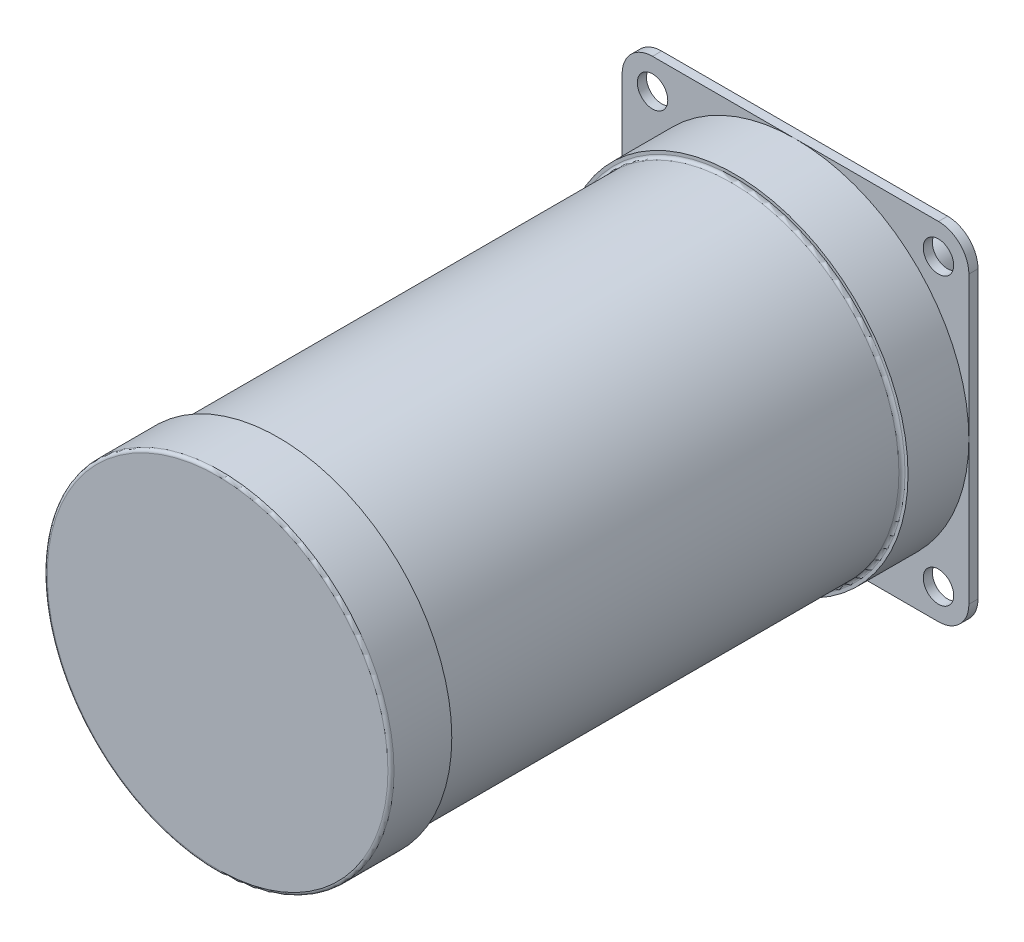
ISO-10303-21;
HEADER;
FILE_DESCRIPTION(('STEP AP214'),'2;1');
FILE_NAME('part.step','',(''),(''),'','','');
FILE_SCHEMA(('AUTOMOTIVE_DESIGN { 1 0 10303 214 1 1 1 1 }'));
ENDSEC;
DATA;
#1=APPLICATION_CONTEXT('core data for automotive mechanical design processes');
#2=APPLICATION_PROTOCOL_DEFINITION('international standard','automotive_design',2000,#1);
#3=PRODUCT_CONTEXT('',#1,'mechanical');
#4=PRODUCT('Part','Part','',(#3));
#5=PRODUCT_RELATED_PRODUCT_CATEGORY('part','',(#4));
#6=PRODUCT_DEFINITION_FORMATION('','',#4);
#7=PRODUCT_DEFINITION_CONTEXT('part definition',#1,'design');
#8=PRODUCT_DEFINITION('design','',#6,#7);
#9=PRODUCT_DEFINITION_SHAPE('','',#8);
#10=(LENGTH_UNIT() NAMED_UNIT(*) SI_UNIT(.MILLI.,.METRE.));
#11=(NAMED_UNIT(*) PLANE_ANGLE_UNIT() SI_UNIT($,.RADIAN.));
#12=(NAMED_UNIT(*) SI_UNIT($,.STERADIAN.) SOLID_ANGLE_UNIT());
#13=UNCERTAINTY_MEASURE_WITH_UNIT(LENGTH_MEASURE(1.E-05),#10,'distance_accuracy_value','');
#14=(GEOMETRIC_REPRESENTATION_CONTEXT(3) GLOBAL_UNCERTAINTY_ASSIGNED_CONTEXT((#13)) GLOBAL_UNIT_ASSIGNED_CONTEXT((#10,
#11,#12)) REPRESENTATION_CONTEXT('',''));
#15=CARTESIAN_POINT('',(0.,0.,0.));
#16=DIRECTION('',(0.,0.,1.));
#17=DIRECTION('',(1.,0.,0.));
#18=AXIS2_PLACEMENT_3D('',#15,#16,#17);
#19=CARTESIAN_POINT('',(0.,0.,1.5));
#20=DIRECTION('',(0.,0.,1.));
#21=DIRECTION('',(1.,0.,0.));
#22=AXIS2_PLACEMENT_3D('',#19,#20,#21);
#23=PLANE('',#22);
#24=CARTESIAN_POINT('',(52.,52.,1.5));
#25=DIRECTION('',(0.,0.,1.));
#26=DIRECTION('',(1.,0.,0.));
#27=AXIS2_PLACEMENT_3D('',#24,#25,#26);
#28=CIRCLE('',#27,2.5);
#29=CARTESIAN_POINT('',(54.5,52.,1.5));
#30=VERTEX_POINT('',#29);
#31=EDGE_CURVE('E290',#30,#30,#28,.F.);
#32=ORIENTED_EDGE('',*,*,#31,.T.);
#33=EDGE_LOOP('',(#32));
#34=FACE_BOUND('',#33,.T.);
#35=DIRECTION('',(0.,1.,0.));
#36=VECTOR('',#35,1.);
#37=CARTESIAN_POINT('',(57.,0.,1.5));
#38=LINE('',#37,#36);
#39=CARTESIAN_POINT('',(57.,28.5,1.5));
#40=VERTEX_POINT('',#39);
#41=CARTESIAN_POINT('',(57.,52.,1.5));
#42=VERTEX_POINT('',#41);
#43=EDGE_CURVE('E133',#40,#42,#38,.T.);
#44=ORIENTED_EDGE('',*,*,#43,.T.);
#45=CARTESIAN_POINT('',(52.,52.,1.5));
#46=DIRECTION('',(0.,0.,1.));
#47=DIRECTION('',(1.,0.,0.));
#48=AXIS2_PLACEMENT_3D('',#45,#46,#47);
#49=CIRCLE('',#48,5.);
#50=CARTESIAN_POINT('',(52.,57.,1.5));
#51=VERTEX_POINT('',#50);
#52=EDGE_CURVE('E54',#42,#51,#49,.T.);
#53=ORIENTED_EDGE('',*,*,#52,.T.);
#54=DIRECTION('',(-1.,0.,0.));
#55=VECTOR('',#54,1.);
#56=CARTESIAN_POINT('',(57.,57.,1.5));
#57=LINE('',#56,#55);
#58=CARTESIAN_POINT('',(28.5,57.,1.5));
#59=VERTEX_POINT('',#58);
#60=EDGE_CURVE('E144',#51,#59,#57,.T.);
#61=ORIENTED_EDGE('',*,*,#60,.T.);
#62=CARTESIAN_POINT('',(28.5,28.5,1.5));
#63=DIRECTION('',(0.,0.,1.));
#64=DIRECTION('',(1.,0.,0.));
#65=AXIS2_PLACEMENT_3D('',#62,#63,#64);
#66=CIRCLE('',#65,28.5);
#67=EDGE_CURVE('E143',#40,#59,#66,.T.);
#68=ORIENTED_EDGE('',*,*,#67,.F.);
#69=EDGE_LOOP('',(#44,#53,#61,#68));
#70=FACE_BOUND('',#69,.T.);
#71=ADVANCED_FACE('F38',(#34,#70),#23,.T.);
#72=CARTESIAN_POINT('',(4.99999999999999,52.,1.5));
#73=DIRECTION('',(0.,0.,1.));
#74=DIRECTION('',(1.,0.,0.));
#75=AXIS2_PLACEMENT_3D('',#72,#73,#74);
#76=CIRCLE('',#75,2.5);
#77=CARTESIAN_POINT('',(7.49999999999999,52.,1.5));
#78=VERTEX_POINT('',#77);
#79=EDGE_CURVE('E314',#78,#78,#76,.F.);
#80=ORIENTED_EDGE('',*,*,#79,.T.);
#81=EDGE_LOOP('',(#80));
#82=FACE_BOUND('',#81,.T.);
#83=CARTESIAN_POINT('',(5.,57.,1.5));
#84=VERTEX_POINT('',#83);
#85=EDGE_CURVE('E132',#59,#84,#57,.T.);
#86=ORIENTED_EDGE('',*,*,#85,.T.);
#87=CARTESIAN_POINT('',(5.,52.,1.5));
#88=DIRECTION('',(0.,0.,1.));
#89=DIRECTION('',(1.,0.,0.));
#90=AXIS2_PLACEMENT_3D('',#87,#88,#89);
#91=CIRCLE('',#90,5.);
#92=CARTESIAN_POINT('',(0.,52.,1.5));
#93=VERTEX_POINT('',#92);
#94=EDGE_CURVE('E228',#84,#93,#91,.T.);
#95=ORIENTED_EDGE('',*,*,#94,.T.);
#96=DIRECTION('',(0.,-1.,0.));
#97=VECTOR('',#96,1.);
#98=CARTESIAN_POINT('',(0.,57.,1.5));
#99=LINE('',#98,#97);
#100=CARTESIAN_POINT('',(0.,28.5,1.5));
#101=VERTEX_POINT('',#100);
#102=EDGE_CURVE('E164',#93,#101,#99,.T.);
#103=ORIENTED_EDGE('',*,*,#102,.T.);
#104=EDGE_CURVE('E152',#59,#101,#66,.T.);
#105=ORIENTED_EDGE('',*,*,#104,.F.);
#106=EDGE_LOOP('',(#86,#95,#103,#105));
#107=FACE_BOUND('',#106,.T.);
#108=ADVANCED_FACE('F348',(#82,#107),#23,.T.);
#109=CARTESIAN_POINT('',(4.99999999999999,5.,1.5));
#110=DIRECTION('',(0.,0.,1.));
#111=DIRECTION('',(1.,0.,0.));
#112=AXIS2_PLACEMENT_3D('',#109,#110,#111);
#113=CIRCLE('',#112,2.5);
#114=CARTESIAN_POINT('',(7.49999999999999,5.,1.5));
#115=VERTEX_POINT('',#114);
#116=EDGE_CURVE('E306',#115,#115,#113,.F.);
#117=ORIENTED_EDGE('',*,*,#116,.T.);
#118=EDGE_LOOP('',(#117));
#119=FACE_BOUND('',#118,.T.);
#120=CARTESIAN_POINT('',(0.,5.,1.5));
#121=VERTEX_POINT('',#120);
#122=EDGE_CURVE('E168',#101,#121,#99,.T.);
#123=ORIENTED_EDGE('',*,*,#122,.T.);
#124=CARTESIAN_POINT('',(5.,5.,1.5));
#125=DIRECTION('',(0.,0.,1.));
#126=DIRECTION('',(1.,0.,0.));
#127=AXIS2_PLACEMENT_3D('',#124,#125,#126);
#128=CIRCLE('',#127,5.);
#129=CARTESIAN_POINT('',(5.,0.,1.5));
#130=VERTEX_POINT('',#129);
#131=EDGE_CURVE('E219',#121,#130,#128,.T.);
#132=ORIENTED_EDGE('',*,*,#131,.T.);
#133=DIRECTION('',(1.,0.,0.));
#134=VECTOR('',#133,1.);
#135=CARTESIAN_POINT('',(0.,0.,1.5));
#136=LINE('',#135,#134);
#137=CARTESIAN_POINT('',(28.5,0.,1.5));
#138=VERTEX_POINT('',#137);
#139=EDGE_CURVE('E141',#130,#138,#136,.T.);
#140=ORIENTED_EDGE('',*,*,#139,.T.);
#141=EDGE_CURVE('E156',#101,#138,#66,.T.);
#142=ORIENTED_EDGE('',*,*,#141,.F.);
#143=EDGE_LOOP('',(#123,#132,#140,#142));
#144=FACE_BOUND('',#143,.T.);
#145=ADVANCED_FACE('F354',(#119,#144),#23,.T.);
#146=CARTESIAN_POINT('',(0.,57.,1.5));
#147=DIRECTION('',(1.,0.,0.));
#148=DIRECTION('',(0.,1.,0.));
#149=AXIS2_PLACEMENT_3D('',#146,#147,#148);
#150=PLANE('',#149);
#151=DIRECTION('',(0.,-1.,0.));
#152=VECTOR('',#151,1.);
#153=CARTESIAN_POINT('',(0.,57.,0.));
#154=LINE('',#153,#152);
#155=CARTESIAN_POINT('',(0.,52.,0.));
#156=VERTEX_POINT('',#155);
#157=CARTESIAN_POINT('',(0.,5.,0.));
#158=VERTEX_POINT('',#157);
#159=EDGE_CURVE('E171',#156,#158,#154,.T.);
#160=ORIENTED_EDGE('',*,*,#159,.T.);
#161=DIRECTION('',(0.,0.,-1.));
#162=VECTOR('',#161,1.);
#163=CARTESIAN_POINT('',(0.,5.,1.5));
#164=LINE('',#163,#162);
#165=EDGE_CURVE('E216',#158,#121,#164,.F.);
#166=ORIENTED_EDGE('',*,*,#165,.T.);
#167=ORIENTED_EDGE('',*,*,#122,.F.);
#168=ORIENTED_EDGE('',*,*,#102,.F.);
#169=DIRECTION('',(0.,0.,-1.));
#170=VECTOR('',#169,1.);
#171=CARTESIAN_POINT('',(0.,52.,1.5));
#172=LINE('',#171,#170);
#173=EDGE_CURVE('E212',#93,#156,#172,.T.);
#174=ORIENTED_EDGE('',*,*,#173,.T.);
#175=EDGE_LOOP('',(#160,#166,#167,#168,#174));
#176=FACE_BOUND('',#175,.T.);
#177=ADVANCED_FACE('F369',(#176),#150,.F.);
#178=CARTESIAN_POINT('',(0.,0.,1.5));
#179=DIRECTION('',(0.,1.,0.));
#180=DIRECTION('',(-1.,0.,0.));
#181=AXIS2_PLACEMENT_3D('',#178,#179,#180);
#182=PLANE('',#181);
#183=DIRECTION('',(1.,0.,0.));
#184=VECTOR('',#183,1.);
#185=CARTESIAN_POINT('',(0.,0.,0.));
#186=LINE('',#185,#184);
#187=CARTESIAN_POINT('',(5.,0.,0.));
#188=VERTEX_POINT('',#187);
#189=CARTESIAN_POINT('',(52.,0.,0.));
#190=VERTEX_POINT('',#189);
#191=EDGE_CURVE('E175',#188,#190,#186,.T.);
#192=ORIENTED_EDGE('',*,*,#191,.T.);
#193=DIRECTION('',(0.,0.,-1.));
#194=VECTOR('',#193,1.);
#195=CARTESIAN_POINT('',(52.,0.,1.5));
#196=LINE('',#195,#194);
#197=CARTESIAN_POINT('',(52.,0.,1.5));
#198=VERTEX_POINT('',#197);
#199=EDGE_CURVE('E207',#190,#198,#196,.F.);
#200=ORIENTED_EDGE('',*,*,#199,.T.);
#201=EDGE_CURVE('E167',#138,#198,#136,.T.);
#202=ORIENTED_EDGE('',*,*,#201,.F.);
#203=ORIENTED_EDGE('',*,*,#139,.F.);
#204=DIRECTION('',(0.,0.,-1.));
#205=VECTOR('',#204,1.);
#206=CARTESIAN_POINT('',(5.,0.,1.5));
#207=LINE('',#206,#205);
#208=EDGE_CURVE('E203',#130,#188,#207,.T.);
#209=ORIENTED_EDGE('',*,*,#208,.T.);
#210=EDGE_LOOP('',(#192,#200,#202,#203,#209));
#211=FACE_BOUND('',#210,.T.);
#212=ADVANCED_FACE('F374',(#211),#182,.F.);
#213=CARTESIAN_POINT('',(57.,0.,1.5));
#214=DIRECTION('',(-1.,0.,0.));
#215=DIRECTION('',(0.,0.,1.));
#216=AXIS2_PLACEMENT_3D('',#213,#214,#215);
#217=PLANE('',#216);
#218=CARTESIAN_POINT('',(57.,4.99999999999999,1.5));
#219=VERTEX_POINT('',#218);
#220=EDGE_CURVE('E119',#219,#40,#38,.T.);
#221=ORIENTED_EDGE('',*,*,#220,.F.);
#222=DIRECTION('',(0.,0.,-1.));
#223=VECTOR('',#222,1.);
#224=CARTESIAN_POINT('',(57.,4.99999999999999,1.5));
#225=LINE('',#224,#223);
#226=CARTESIAN_POINT('',(57.,4.99999999999999,0.));
#227=VERTEX_POINT('',#226);
#228=EDGE_CURVE('E187',#219,#227,#225,.T.);
#229=ORIENTED_EDGE('',*,*,#228,.T.);
#230=DIRECTION('',(0.,1.,0.));
#231=VECTOR('',#230,1.);
#232=CARTESIAN_POINT('',(57.,0.,0.));
#233=LINE('',#232,#231);
#234=CARTESIAN_POINT('',(57.,52.,0.));
#235=VERTEX_POINT('',#234);
#236=EDGE_CURVE('E179',#227,#235,#233,.T.);
#237=ORIENTED_EDGE('',*,*,#236,.T.);
#238=DIRECTION('',(0.,0.,-1.));
#239=VECTOR('',#238,1.);
#240=CARTESIAN_POINT('',(57.,52.,1.5));
#241=LINE('',#240,#239);
#242=EDGE_CURVE('E139',#235,#42,#241,.F.);
#243=ORIENTED_EDGE('',*,*,#242,.T.);
#244=ORIENTED_EDGE('',*,*,#43,.F.);
#245=EDGE_LOOP('',(#221,#229,#237,#243,#244));
#246=FACE_BOUND('',#245,.T.);
#247=ADVANCED_FACE('F136',(#246),#217,.F.);
#248=CARTESIAN_POINT('',(57.,57.,1.5));
#249=DIRECTION('',(0.,-1.,0.));
#250=DIRECTION('',(0.,0.,-1.));
#251=AXIS2_PLACEMENT_3D('',#248,#249,#250);
#252=PLANE('',#251);
#253=DIRECTION('',(-1.,0.,0.));
#254=VECTOR('',#253,1.);
#255=CARTESIAN_POINT('',(57.,57.,0.));
#256=LINE('',#255,#254);
#257=CARTESIAN_POINT('',(52.,57.,0.));
#258=VERTEX_POINT('',#257);
#259=CARTESIAN_POINT('',(5.,57.,0.));
#260=VERTEX_POINT('',#259);
#261=EDGE_CURVE('E182',#258,#260,#256,.T.);
#262=ORIENTED_EDGE('',*,*,#261,.T.);
#263=DIRECTION('',(0.,0.,-1.));
#264=VECTOR('',#263,1.);
#265=CARTESIAN_POINT('',(5.,57.,1.5));
#266=LINE('',#265,#264);
#267=EDGE_CURVE('E62',#260,#84,#266,.F.);
#268=ORIENTED_EDGE('',*,*,#267,.T.);
#269=ORIENTED_EDGE('',*,*,#85,.F.);
#270=ORIENTED_EDGE('',*,*,#60,.F.);
#271=DIRECTION('',(0.,0.,-1.));
#272=VECTOR('',#271,1.);
#273=CARTESIAN_POINT('',(52.,57.,1.5));
#274=LINE('',#273,#272);
#275=EDGE_CURVE('E222',#51,#258,#274,.T.);
#276=ORIENTED_EDGE('',*,*,#275,.T.);
#277=EDGE_LOOP('',(#262,#268,#269,#270,#276));
#278=FACE_BOUND('',#277,.T.);
#279=ADVANCED_FACE('F360',(#278),#252,.F.);
#280=CARTESIAN_POINT('',(52.,5.,1.5));
#281=DIRECTION('',(0.,0.,1.));
#282=DIRECTION('',(1.,0.,0.));
#283=AXIS2_PLACEMENT_3D('',#280,#281,#282);
#284=CIRCLE('',#283,2.5);
#285=CARTESIAN_POINT('',(54.5,5.,1.5));
#286=VERTEX_POINT('',#285);
#287=EDGE_CURVE('E297',#286,#286,#284,.F.);
#288=ORIENTED_EDGE('',*,*,#287,.T.);
#289=EDGE_LOOP('',(#288));
#290=FACE_BOUND('',#289,.T.);
#291=ORIENTED_EDGE('',*,*,#201,.T.);
#292=CARTESIAN_POINT('',(52.,4.99999999999999,1.5));
#293=DIRECTION('',(0.,0.,1.));
#294=DIRECTION('',(1.,0.,0.));
#295=AXIS2_PLACEMENT_3D('',#292,#293,#294);
#296=CIRCLE('',#295,5.);
#297=EDGE_CURVE('E127',#198,#219,#296,.T.);
#298=ORIENTED_EDGE('',*,*,#297,.T.);
#299=ORIENTED_EDGE('',*,*,#220,.T.);
#300=EDGE_CURVE('E124',#138,#40,#66,.T.);
#301=ORIENTED_EDGE('',*,*,#300,.F.);
#302=EDGE_LOOP('',(#291,#298,#299,#301));
#303=FACE_BOUND('',#302,.T.);
#304=ADVANCED_FACE('F122',(#290,#303),#23,.T.);
#305=CARTESIAN_POINT('',(0.,0.,0.));
#306=DIRECTION('',(0.,0.,1.));
#307=DIRECTION('',(1.,0.,0.));
#308=AXIS2_PLACEMENT_3D('',#305,#306,#307);
#309=PLANE('',#308);
#310=CARTESIAN_POINT('',(28.5,28.5,0.));
#311=DIRECTION('',(0.,0.,1.));
#312=DIRECTION('',(1.,0.,0.));
#313=AXIS2_PLACEMENT_3D('',#310,#311,#312);
#314=CIRCLE('',#313,19.5);
#315=CARTESIAN_POINT('',(48.,28.5,0.));
#316=VERTEX_POINT('',#315);
#317=EDGE_CURVE('E245',#316,#316,#314,.T.);
#318=ORIENTED_EDGE('',*,*,#317,.T.);
#319=EDGE_LOOP('',(#318));
#320=FACE_BOUND('',#319,.T.);
#321=CARTESIAN_POINT('',(52.,5.,0.));
#322=DIRECTION('',(0.,0.,-1.));
#323=DIRECTION('',(-1.,0.,0.));
#324=AXIS2_PLACEMENT_3D('',#321,#322,#323);
#325=CIRCLE('',#324,2.5);
#326=CARTESIAN_POINT('',(49.5,5.,0.));
#327=VERTEX_POINT('',#326);
#328=EDGE_CURVE('E301',#327,#327,#325,.T.);
#329=ORIENTED_EDGE('',*,*,#328,.F.);
#330=EDGE_LOOP('',(#329));
#331=FACE_BOUND('',#330,.T.);
#332=CARTESIAN_POINT('',(4.99999999999999,5.,0.));
#333=DIRECTION('',(0.,0.,-1.));
#334=DIRECTION('',(-1.,0.,0.));
#335=AXIS2_PLACEMENT_3D('',#332,#333,#334);
#336=CIRCLE('',#335,2.5);
#337=CARTESIAN_POINT('',(2.49999999999999,5.,0.));
#338=VERTEX_POINT('',#337);
#339=EDGE_CURVE('E310',#338,#338,#336,.T.);
#340=ORIENTED_EDGE('',*,*,#339,.F.);
#341=EDGE_LOOP('',(#340));
#342=FACE_BOUND('',#341,.T.);
#343=CARTESIAN_POINT('',(4.99999999999999,52.,0.));
#344=DIRECTION('',(0.,0.,-1.));
#345=DIRECTION('',(-1.,0.,0.));
#346=AXIS2_PLACEMENT_3D('',#343,#344,#345);
#347=CIRCLE('',#346,2.5);
#348=CARTESIAN_POINT('',(2.49999999999999,52.,0.));
#349=VERTEX_POINT('',#348);
#350=EDGE_CURVE('E295',#349,#349,#347,.T.);
#351=ORIENTED_EDGE('',*,*,#350,.F.);
#352=EDGE_LOOP('',(#351));
#353=FACE_BOUND('',#352,.T.);
#354=CARTESIAN_POINT('',(52.,52.,0.));
#355=DIRECTION('',(0.,0.,-1.));
#356=DIRECTION('',(-1.,0.,0.));
#357=AXIS2_PLACEMENT_3D('',#354,#355,#356);
#358=CIRCLE('',#357,2.5);
#359=CARTESIAN_POINT('',(49.5,52.,0.));
#360=VERTEX_POINT('',#359);
#361=EDGE_CURVE('E287',#360,#360,#358,.T.);
#362=ORIENTED_EDGE('',*,*,#361,.F.);
#363=EDGE_LOOP('',(#362));
#364=FACE_BOUND('',#363,.T.);
#365=ORIENTED_EDGE('',*,*,#236,.F.);
#366=CARTESIAN_POINT('',(52.,4.99999999999999,0.));
#367=DIRECTION('',(0.,0.,1.));
#368=DIRECTION('',(1.,0.,0.));
#369=AXIS2_PLACEMENT_3D('',#366,#367,#368);
#370=CIRCLE('',#369,5.);
#371=EDGE_CURVE('E200',#227,#190,#370,.F.);
#372=ORIENTED_EDGE('',*,*,#371,.T.);
#373=ORIENTED_EDGE('',*,*,#191,.F.);
#374=CARTESIAN_POINT('',(5.,5.,0.));
#375=DIRECTION('',(0.,0.,1.));
#376=DIRECTION('',(1.,0.,0.));
#377=AXIS2_PLACEMENT_3D('',#374,#375,#376);
#378=CIRCLE('',#377,5.);
#379=EDGE_CURVE('E197',#188,#158,#378,.F.);
#380=ORIENTED_EDGE('',*,*,#379,.T.);
#381=ORIENTED_EDGE('',*,*,#159,.F.);
#382=CARTESIAN_POINT('',(5.,52.,0.));
#383=DIRECTION('',(0.,0.,1.));
#384=DIRECTION('',(1.,0.,0.));
#385=AXIS2_PLACEMENT_3D('',#382,#383,#384);
#386=CIRCLE('',#385,5.);
#387=EDGE_CURVE('E194',#156,#260,#386,.F.);
#388=ORIENTED_EDGE('',*,*,#387,.T.);
#389=ORIENTED_EDGE('',*,*,#261,.F.);
#390=CARTESIAN_POINT('',(52.,52.,0.));
#391=DIRECTION('',(0.,0.,1.));
#392=DIRECTION('',(1.,0.,0.));
#393=AXIS2_PLACEMENT_3D('',#390,#391,#392);
#394=CIRCLE('',#393,5.);
#395=EDGE_CURVE('E191',#258,#235,#394,.F.);
#396=ORIENTED_EDGE('',*,*,#395,.T.);
#397=EDGE_LOOP('',(#365,#372,#373,#380,#381,#388,#389,#396));
#398=FACE_BOUND('',#397,.T.);
#399=ADVANCED_FACE('F359',(#320,#331,#342,#353,#364,#398),#309,.F.);
#400=CARTESIAN_POINT('',(28.5,28.5,11.5));
#401=DIRECTION('',(0.,0.,-1.));
#402=DIRECTION('',(-1.,0.,0.));
#403=AXIS2_PLACEMENT_3D('',#400,#401,#402);
#404=CYLINDRICAL_SURFACE('',#403,28.5);
#405=CARTESIAN_POINT('',(28.5,28.5,11.5));
#406=DIRECTION('',(0.,0.,1.));
#407=DIRECTION('',(1.,0.,0.));
#408=AXIS2_PLACEMENT_3D('',#405,#406,#407);
#409=CIRCLE('',#408,28.5);
#410=CARTESIAN_POINT('',(57.,28.5,11.5));
#411=VERTEX_POINT('',#410);
#412=EDGE_CURVE('E149',#411,#411,#409,.T.);
#413=ORIENTED_EDGE('',*,*,#412,.F.);
#414=EDGE_LOOP('',(#413));
#415=FACE_BOUND('',#414,.T.);
#416=ORIENTED_EDGE('',*,*,#67,.T.);
#417=ORIENTED_EDGE('',*,*,#104,.T.);
#418=ORIENTED_EDGE('',*,*,#141,.T.);
#419=ORIENTED_EDGE('',*,*,#300,.T.);
#420=EDGE_LOOP('',(#416,#417,#418,#419));
#421=FACE_BOUND('',#420,.T.);
#422=ADVANCED_FACE('F154',(#415,#421),#404,.T.);
#423=CARTESIAN_POINT('',(28.5,28.5,11.5));
#424=DIRECTION('',(0.,0.,1.));
#425=DIRECTION('',(1.,0.,0.));
#426=AXIS2_PLACEMENT_3D('',#423,#424,#425);
#427=PLANE('',#426);
#428=CARTESIAN_POINT('',(28.5,28.5,11.5));
#429=DIRECTION('',(0.,0.,1.));
#430=DIRECTION('',(1.,0.,0.));
#431=AXIS2_PLACEMENT_3D('',#428,#429,#430);
#432=CIRCLE('',#431,28.);
#433=CARTESIAN_POINT('',(56.5,28.5,11.5));
#434=VERTEX_POINT('',#433);
#435=EDGE_CURVE('E11',#434,#434,#432,.F.);
#436=ORIENTED_EDGE('',*,*,#435,.T.);
#437=EDGE_LOOP('',(#436));
#438=FACE_BOUND('',#437,.T.);
#439=ORIENTED_EDGE('',*,*,#412,.T.);
#440=EDGE_LOOP('',(#439));
#441=FACE_BOUND('',#440,.T.);
#442=ADVANCED_FACE('F412',(#438,#441),#427,.T.);
#443=CARTESIAN_POINT('',(28.5,28.5,86.5));
#444=DIRECTION('',(0.,0.,-1.));
#445=DIRECTION('',(-1.,0.,0.));
#446=AXIS2_PLACEMENT_3D('',#443,#444,#445);
#447=CYLINDRICAL_SURFACE('',#446,27.5);
#448=CARTESIAN_POINT('',(28.5,28.5,86.));
#449=DIRECTION('',(0.,0.,1.));
#450=DIRECTION('',(1.,0.,0.));
#451=AXIS2_PLACEMENT_3D('',#448,#449,#450);
#452=CIRCLE('',#451,27.5);
#453=CARTESIAN_POINT('',(56.,28.5,86.));
#454=VERTEX_POINT('',#453);
#455=EDGE_CURVE('E47',#454,#454,#452,.F.);
#456=ORIENTED_EDGE('',*,*,#455,.T.);
#457=EDGE_LOOP('',(#456));
#458=FACE_BOUND('',#457,.T.);
#459=CARTESIAN_POINT('',(28.5,28.5,12.));
#460=DIRECTION('',(0.,0.,1.));
#461=DIRECTION('',(1.,0.,0.));
#462=AXIS2_PLACEMENT_3D('',#459,#460,#461);
#463=CIRCLE('',#462,27.5);
#464=CARTESIAN_POINT('',(56.,28.5,12.));
#465=VERTEX_POINT('',#464);
#466=EDGE_CURVE('E261',#465,#465,#463,.T.);
#467=ORIENTED_EDGE('',*,*,#466,.T.);
#468=EDGE_LOOP('',(#467));
#469=FACE_BOUND('',#468,.T.);
#470=ADVANCED_FACE('F268',(#458,#469),#447,.T.);
#471=CARTESIAN_POINT('',(28.5,28.5,96.5));
#472=DIRECTION('',(0.,0.,-1.));
#473=DIRECTION('',(-1.,0.,0.));
#474=AXIS2_PLACEMENT_3D('',#471,#472,#473);
#475=CYLINDRICAL_SURFACE('',#474,28.5);
#476=CARTESIAN_POINT('',(28.5,28.5,96.));
#477=DIRECTION('',(0.,0.,1.));
#478=DIRECTION('',(1.,0.,0.));
#479=AXIS2_PLACEMENT_3D('',#476,#477,#478);
#480=CIRCLE('',#479,28.5);
#481=CARTESIAN_POINT('',(57.,28.5,96.));
#482=VERTEX_POINT('',#481);
#483=EDGE_CURVE('E253',#482,#482,#480,.F.);
#484=ORIENTED_EDGE('',*,*,#483,.T.);
#485=EDGE_LOOP('',(#484));
#486=FACE_BOUND('',#485,.T.);
#487=CARTESIAN_POINT('',(28.5,28.5,86.5));
#488=DIRECTION('',(0.,0.,1.));
#489=DIRECTION('',(1.,0.,0.));
#490=AXIS2_PLACEMENT_3D('',#487,#488,#489);
#491=CIRCLE('',#490,28.5);
#492=CARTESIAN_POINT('',(57.,28.5,86.5));
#493=VERTEX_POINT('',#492);
#494=EDGE_CURVE('E150',#493,#493,#491,.T.);
#495=ORIENTED_EDGE('',*,*,#494,.T.);
#496=EDGE_LOOP('',(#495));
#497=FACE_BOUND('',#496,.T.);
#498=ADVANCED_FACE('F423',(#486,#497),#475,.T.);
#499=CARTESIAN_POINT('',(28.5,28.5,96.5));
#500=DIRECTION('',(0.,0.,1.));
#501=DIRECTION('',(1.,0.,0.));
#502=AXIS2_PLACEMENT_3D('',#499,#500,#501);
#503=PLANE('',#502);
#504=CARTESIAN_POINT('',(28.5,28.5,96.5));
#505=DIRECTION('',(0.,0.,1.));
#506=DIRECTION('',(1.,0.,0.));
#507=AXIS2_PLACEMENT_3D('',#504,#505,#506);
#508=CIRCLE('',#507,28.);
#509=CARTESIAN_POINT('',(56.5,28.5,96.5));
#510=VERTEX_POINT('',#509);
#511=EDGE_CURVE('E249',#510,#510,#508,.T.);
#512=ORIENTED_EDGE('',*,*,#511,.T.);
#513=EDGE_LOOP('',(#512));
#514=FACE_BOUND('',#513,.T.);
#515=ADVANCED_FACE('F281',(#514),#503,.T.);
#516=CARTESIAN_POINT('',(28.5,28.5,86.5));
#517=DIRECTION('',(0.,0.,1.));
#518=DIRECTION('',(1.,0.,0.));
#519=AXIS2_PLACEMENT_3D('',#516,#517,#518);
#520=PLANE('',#519);
#521=CARTESIAN_POINT('',(28.5,28.5,86.5));
#522=DIRECTION('',(0.,0.,1.));
#523=DIRECTION('',(1.,0.,0.));
#524=AXIS2_PLACEMENT_3D('',#521,#522,#523);
#525=CIRCLE('',#524,28.);
#526=CARTESIAN_POINT('',(56.5,28.5,86.5));
#527=VERTEX_POINT('',#526);
#528=EDGE_CURVE('E257',#527,#527,#525,.T.);
#529=ORIENTED_EDGE('',*,*,#528,.T.);
#530=EDGE_LOOP('',(#529));
#531=FACE_BOUND('',#530,.T.);
#532=ORIENTED_EDGE('',*,*,#494,.F.);
#533=EDGE_LOOP('',(#532));
#534=FACE_BOUND('',#533,.T.);
#535=ADVANCED_FACE('F277',(#531,#534),#520,.F.);
#536=CARTESIAN_POINT('',(52.,52.,96.501));
#537=DIRECTION('',(0.,0.,-1.));
#538=DIRECTION('',(-1.,0.,0.));
#539=AXIS2_PLACEMENT_3D('',#536,#537,#538);
#540=CYLINDRICAL_SURFACE('',#539,2.5);
#541=ORIENTED_EDGE('',*,*,#31,.F.);
#542=EDGE_LOOP('',(#541));
#543=FACE_BOUND('',#542,.T.);
#544=ORIENTED_EDGE('',*,*,#361,.T.);
#545=EDGE_LOOP('',(#544));
#546=FACE_BOUND('',#545,.T.);
#547=ADVANCED_FACE('F280',(#543,#546),#540,.F.);
#548=CARTESIAN_POINT('',(4.99999999999999,52.,96.501));
#549=DIRECTION('',(0.,0.,-1.));
#550=DIRECTION('',(-1.,0.,0.));
#551=AXIS2_PLACEMENT_3D('',#548,#549,#550);
#552=CYLINDRICAL_SURFACE('',#551,2.5);
#553=ORIENTED_EDGE('',*,*,#79,.F.);
#554=EDGE_LOOP('',(#553));
#555=FACE_BOUND('',#554,.T.);
#556=ORIENTED_EDGE('',*,*,#350,.T.);
#557=EDGE_LOOP('',(#556));
#558=FACE_BOUND('',#557,.T.);
#559=ADVANCED_FACE('F432',(#555,#558),#552,.F.);
#560=CARTESIAN_POINT('',(4.99999999999999,5.,96.501));
#561=DIRECTION('',(0.,0.,-1.));
#562=DIRECTION('',(-1.,0.,0.));
#563=AXIS2_PLACEMENT_3D('',#560,#561,#562);
#564=CYLINDRICAL_SURFACE('',#563,2.5);
#565=ORIENTED_EDGE('',*,*,#116,.F.);
#566=EDGE_LOOP('',(#565));
#567=FACE_BOUND('',#566,.T.);
#568=ORIENTED_EDGE('',*,*,#339,.T.);
#569=EDGE_LOOP('',(#568));
#570=FACE_BOUND('',#569,.T.);
#571=ADVANCED_FACE('F436',(#567,#570),#564,.F.);
#572=CARTESIAN_POINT('',(52.,5.,96.501));
#573=DIRECTION('',(0.,0.,-1.));
#574=DIRECTION('',(-1.,0.,0.));
#575=AXIS2_PLACEMENT_3D('',#572,#573,#574);
#576=CYLINDRICAL_SURFACE('',#575,2.5);
#577=ORIENTED_EDGE('',*,*,#287,.F.);
#578=EDGE_LOOP('',(#577));
#579=FACE_BOUND('',#578,.T.);
#580=ORIENTED_EDGE('',*,*,#328,.T.);
#581=EDGE_LOOP('',(#580));
#582=FACE_BOUND('',#581,.T.);
#583=ADVANCED_FACE('F344',(#579,#582),#576,.F.);
#584=CARTESIAN_POINT('',(28.5,28.5,-1.5));
#585=DIRECTION('',(0.,0.,1.));
#586=DIRECTION('',(1.,0.,0.));
#587=AXIS2_PLACEMENT_3D('',#584,#585,#586);
#588=CYLINDRICAL_SURFACE('',#587,19.);
#589=CARTESIAN_POINT('',(28.5,28.5,-1.));
#590=DIRECTION('',(0.,0.,-1.));
#591=DIRECTION('',(-1.,0.,0.));
#592=AXIS2_PLACEMENT_3D('',#589,#590,#591);
#593=CIRCLE('',#592,19.);
#594=CARTESIAN_POINT('',(9.49999999999999,28.5,-1.));
#595=VERTEX_POINT('',#594);
#596=EDGE_CURVE('E241',#595,#595,#593,.F.);
#597=ORIENTED_EDGE('',*,*,#596,.T.);
#598=EDGE_LOOP('',(#597));
#599=FACE_BOUND('',#598,.T.);
#600=CARTESIAN_POINT('',(28.5,28.5,-0.5));
#601=DIRECTION('',(0.,0.,1.));
#602=DIRECTION('',(1.,0.,0.));
#603=AXIS2_PLACEMENT_3D('',#600,#601,#602);
#604=CIRCLE('',#603,19.);
#605=CARTESIAN_POINT('',(47.5,28.5,-0.5));
#606=VERTEX_POINT('',#605);
#607=EDGE_CURVE('E237',#606,#606,#604,.F.);
#608=ORIENTED_EDGE('',*,*,#607,.T.);
#609=EDGE_LOOP('',(#608));
#610=FACE_BOUND('',#609,.T.);
#611=ADVANCED_FACE('F338',(#599,#610),#588,.T.);
#612=CARTESIAN_POINT('',(28.5,28.5,-1.5));
#613=DIRECTION('',(0.,0.,-1.));
#614=DIRECTION('',(-1.,0.,0.));
#615=AXIS2_PLACEMENT_3D('',#612,#613,#614);
#616=PLANE('',#615);
#617=CARTESIAN_POINT('',(28.5,28.5,-1.5));
#618=DIRECTION('',(0.,0.,-1.));
#619=DIRECTION('',(-1.,0.,0.));
#620=AXIS2_PLACEMENT_3D('',#617,#618,#619);
#621=CIRCLE('',#620,18.5);
#622=CARTESIAN_POINT('',(9.99999999999999,28.5,-1.5));
#623=VERTEX_POINT('',#622);
#624=EDGE_CURVE('E233',#623,#623,#621,.T.);
#625=ORIENTED_EDGE('',*,*,#624,.T.);
#626=EDGE_LOOP('',(#625));
#627=FACE_BOUND('',#626,.T.);
#628=CARTESIAN_POINT('',(28.5,28.5,-1.5));
#629=DIRECTION('',(0.,0.,-1.));
#630=DIRECTION('',(-1.,0.,0.));
#631=AXIS2_PLACEMENT_3D('',#628,#629,#630);
#632=CIRCLE('',#631,4.);
#633=CARTESIAN_POINT('',(24.5,28.5,-1.5));
#634=VERTEX_POINT('',#633);
#635=EDGE_CURVE('E188',#634,#634,#632,.T.);
#636=ORIENTED_EDGE('',*,*,#635,.F.);
#637=EDGE_LOOP('',(#636));
#638=FACE_BOUND('',#637,.T.);
#639=ADVANCED_FACE('F333',(#627,#638),#616,.T.);
#640=CARTESIAN_POINT('',(28.5,28.5,-21.5));
#641=DIRECTION('',(0.,0.,1.));
#642=DIRECTION('',(1.,0.,0.));
#643=AXIS2_PLACEMENT_3D('',#640,#641,#642);
#644=CYLINDRICAL_SURFACE('',#643,4.);
#645=CARTESIAN_POINT('',(28.5,28.5,-21.5));
#646=DIRECTION('',(0.,0.,-1.));
#647=DIRECTION('',(-1.,0.,0.));
#648=AXIS2_PLACEMENT_3D('',#645,#646,#647);
#649=CIRCLE('',#648,4.);
#650=CARTESIAN_POINT('',(24.5,28.5,-21.5));
#651=VERTEX_POINT('',#650);
#652=EDGE_CURVE('E302',#651,#651,#649,.T.);
#653=ORIENTED_EDGE('',*,*,#652,.F.);
#654=EDGE_LOOP('',(#653));
#655=FACE_BOUND('',#654,.T.);
#656=ORIENTED_EDGE('',*,*,#635,.T.);
#657=EDGE_LOOP('',(#656));
#658=FACE_BOUND('',#657,.T.);
#659=ADVANCED_FACE('F330',(#655,#658),#644,.T.);
#660=CARTESIAN_POINT('',(28.5,28.5,-21.5));
#661=DIRECTION('',(0.,0.,-1.));
#662=DIRECTION('',(-1.,0.,0.));
#663=AXIS2_PLACEMENT_3D('',#660,#661,#662);
#664=PLANE('',#663);
#665=ORIENTED_EDGE('',*,*,#652,.T.);
#666=EDGE_LOOP('',(#665));
#667=FACE_BOUND('',#666,.T.);
#668=ADVANCED_FACE('F328',(#667),#664,.T.);
#669=CARTESIAN_POINT('',(52.,4.99999999999999,1.5));
#670=DIRECTION('',(0.,0.,-1.));
#671=DIRECTION('',(-1.,0.,0.));
#672=AXIS2_PLACEMENT_3D('',#669,#670,#671);
#673=CYLINDRICAL_SURFACE('',#672,5.);
#674=ORIENTED_EDGE('',*,*,#297,.F.);
#675=ORIENTED_EDGE('',*,*,#199,.F.);
#676=ORIENTED_EDGE('',*,*,#371,.F.);
#677=ORIENTED_EDGE('',*,*,#228,.F.);
#678=EDGE_LOOP('',(#674,#675,#676,#677));
#679=FACE_BOUND('',#678,.T.);
#680=ADVANCED_FACE('F396',(#679),#673,.T.);
#681=CARTESIAN_POINT('',(5.,5.,1.5));
#682=DIRECTION('',(0.,0.,-1.));
#683=DIRECTION('',(-1.,0.,0.));
#684=AXIS2_PLACEMENT_3D('',#681,#682,#683);
#685=CYLINDRICAL_SURFACE('',#684,5.);
#686=ORIENTED_EDGE('',*,*,#131,.F.);
#687=ORIENTED_EDGE('',*,*,#165,.F.);
#688=ORIENTED_EDGE('',*,*,#379,.F.);
#689=ORIENTED_EDGE('',*,*,#208,.F.);
#690=EDGE_LOOP('',(#686,#687,#688,#689));
#691=FACE_BOUND('',#690,.T.);
#692=ADVANCED_FACE('F388',(#691),#685,.T.);
#693=CARTESIAN_POINT('',(5.,52.,1.5));
#694=DIRECTION('',(0.,0.,-1.));
#695=DIRECTION('',(-1.,0.,0.));
#696=AXIS2_PLACEMENT_3D('',#693,#694,#695);
#697=CYLINDRICAL_SURFACE('',#696,5.);
#698=ORIENTED_EDGE('',*,*,#94,.F.);
#699=ORIENTED_EDGE('',*,*,#267,.F.);
#700=ORIENTED_EDGE('',*,*,#387,.F.);
#701=ORIENTED_EDGE('',*,*,#173,.F.);
#702=EDGE_LOOP('',(#698,#699,#700,#701));
#703=FACE_BOUND('',#702,.T.);
#704=ADVANCED_FACE('F404',(#703),#697,.T.);
#705=CARTESIAN_POINT('',(52.,52.,1.5));
#706=DIRECTION('',(0.,0.,-1.));
#707=DIRECTION('',(-1.,0.,0.));
#708=AXIS2_PLACEMENT_3D('',#705,#706,#707);
#709=CYLINDRICAL_SURFACE('',#708,5.);
#710=ORIENTED_EDGE('',*,*,#52,.F.);
#711=ORIENTED_EDGE('',*,*,#242,.F.);
#712=ORIENTED_EDGE('',*,*,#395,.F.);
#713=ORIENTED_EDGE('',*,*,#275,.F.);
#714=EDGE_LOOP('',(#710,#711,#712,#713));
#715=FACE_BOUND('',#714,.T.);
#716=ADVANCED_FACE('F398',(#715),#709,.T.);
#717=CARTESIAN_POINT('',(28.5,28.5,-1.));
#718=DIRECTION('',(0.,0.,-1.));
#719=DIRECTION('',(-1.,0.,0.));
#720=AXIS2_PLACEMENT_3D('',#717,#718,#719);
#721=TOROIDAL_SURFACE('',#720,18.5,0.5);
#722=ORIENTED_EDGE('',*,*,#596,.F.);
#723=EDGE_LOOP('',(#722));
#724=FACE_BOUND('',#723,.T.);
#725=ORIENTED_EDGE('',*,*,#624,.F.);
#726=EDGE_LOOP('',(#725));
#727=FACE_BOUND('',#726,.T.);
#728=ADVANCED_FACE('F481',(#724,#727),#721,.T.);
#729=CARTESIAN_POINT('',(28.5,28.5,-0.5));
#730=DIRECTION('',(0.,0.,1.));
#731=DIRECTION('',(1.,0.,0.));
#732=AXIS2_PLACEMENT_3D('',#729,#730,#731);
#733=TOROIDAL_SURFACE('',#732,19.5,0.5);
#734=ORIENTED_EDGE('',*,*,#317,.F.);
#735=EDGE_LOOP('',(#734));
#736=FACE_BOUND('',#735,.T.);
#737=ORIENTED_EDGE('',*,*,#607,.F.);
#738=EDGE_LOOP('',(#737));
#739=FACE_BOUND('',#738,.T.);
#740=ADVANCED_FACE('F486',(#736,#739),#733,.F.);
#741=CARTESIAN_POINT('',(28.5,28.5,96.));
#742=DIRECTION('',(0.,0.,1.));
#743=DIRECTION('',(1.,0.,0.));
#744=AXIS2_PLACEMENT_3D('',#741,#742,#743);
#745=TOROIDAL_SURFACE('',#744,28.,0.5);
#746=ORIENTED_EDGE('',*,*,#483,.F.);
#747=EDGE_LOOP('',(#746));
#748=FACE_BOUND('',#747,.T.);
#749=ORIENTED_EDGE('',*,*,#511,.F.);
#750=EDGE_LOOP('',(#749));
#751=FACE_BOUND('',#750,.T.);
#752=ADVANCED_FACE('F274',(#748,#751),#745,.T.);
#753=CARTESIAN_POINT('',(28.5,28.5,86.));
#754=DIRECTION('',(0.,0.,1.));
#755=DIRECTION('',(1.,0.,0.));
#756=AXIS2_PLACEMENT_3D('',#753,#754,#755);
#757=TOROIDAL_SURFACE('',#756,28.,0.5);
#758=ORIENTED_EDGE('',*,*,#455,.F.);
#759=EDGE_LOOP('',(#758));
#760=FACE_BOUND('',#759,.T.);
#761=ORIENTED_EDGE('',*,*,#528,.F.);
#762=EDGE_LOOP('',(#761));
#763=FACE_BOUND('',#762,.T.);
#764=ADVANCED_FACE('F271',(#760,#763),#757,.F.);
#765=CARTESIAN_POINT('',(28.5,28.5,12.));
#766=DIRECTION('',(0.,0.,1.));
#767=DIRECTION('',(1.,0.,0.));
#768=AXIS2_PLACEMENT_3D('',#765,#766,#767);
#769=TOROIDAL_SURFACE('',#768,28.,0.5);
#770=ORIENTED_EDGE('',*,*,#435,.F.);
#771=EDGE_LOOP('',(#770));
#772=FACE_BOUND('',#771,.T.);
#773=ORIENTED_EDGE('',*,*,#466,.F.);
#774=EDGE_LOOP('',(#773));
#775=FACE_BOUND('',#774,.T.);
#776=ADVANCED_FACE('F40',(#772,#775),#769,.F.);
#777=CLOSED_SHELL('',(#71,#108,#145,#177,#212,#247,#279,#304,#399,#422,#442,#470,#498,#515,#535,
#547,#559,#571,#583,#611,#639,#659,#668,#680,#692,#704,#716,#728,#740,#752,#764,#776));
#778=MANIFOLD_SOLID_BREP('B2',#777);
#779=ADVANCED_BREP_SHAPE_REPRESENTATION('',(#18,#778),#14);
#780=SHAPE_DEFINITION_REPRESENTATION(#9,#779);
ENDSEC;
END-ISO-10303-21;
